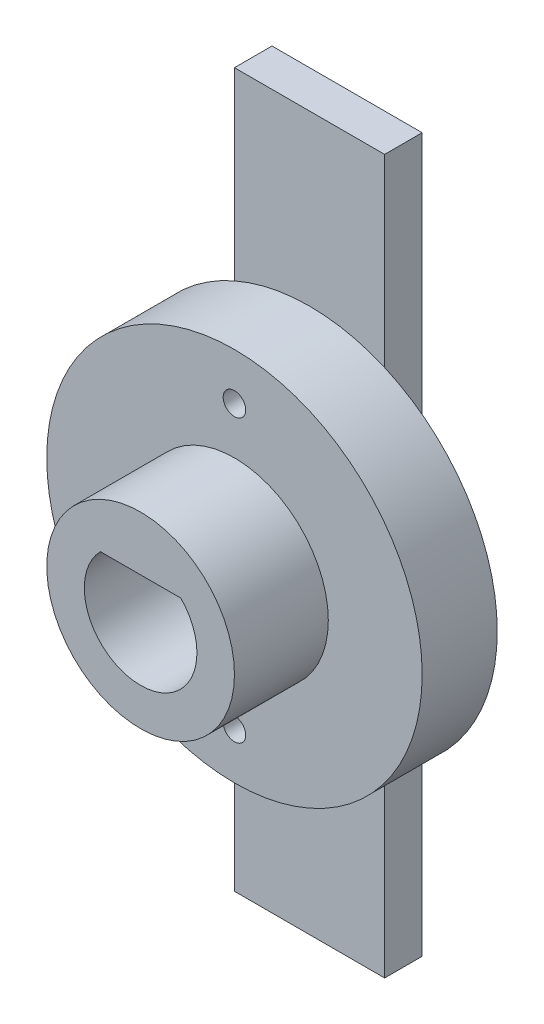
ISO-10303-21;
HEADER;
FILE_DESCRIPTION(('STEP AP214'),'2;1');
FILE_NAME('part.step','',(''),(''),'','','');
FILE_SCHEMA(('AUTOMOTIVE_DESIGN { 1 0 10303 214 1 1 1 1 }'));
ENDSEC;
DATA;
#1=APPLICATION_CONTEXT('core data for automotive mechanical design processes');
#2=APPLICATION_PROTOCOL_DEFINITION('international standard','automotive_design',2000,#1);
#3=PRODUCT_CONTEXT('',#1,'mechanical');
#4=PRODUCT('Part','Part','',(#3));
#5=PRODUCT_RELATED_PRODUCT_CATEGORY('part','',(#4));
#6=PRODUCT_DEFINITION_FORMATION('','',#4);
#7=PRODUCT_DEFINITION_CONTEXT('part definition',#1,'design');
#8=PRODUCT_DEFINITION('design','',#6,#7);
#9=PRODUCT_DEFINITION_SHAPE('','',#8);
#10=(LENGTH_UNIT() NAMED_UNIT(*) SI_UNIT(.MILLI.,.METRE.));
#11=(NAMED_UNIT(*) PLANE_ANGLE_UNIT() SI_UNIT($,.RADIAN.));
#12=(NAMED_UNIT(*) SI_UNIT($,.STERADIAN.) SOLID_ANGLE_UNIT());
#13=UNCERTAINTY_MEASURE_WITH_UNIT(LENGTH_MEASURE(1.E-05),#10,'distance_accuracy_value','');
#14=(GEOMETRIC_REPRESENTATION_CONTEXT(3) GLOBAL_UNCERTAINTY_ASSIGNED_CONTEXT((#13)) GLOBAL_UNIT_ASSIGNED_CONTEXT((#10,
#11,#12)) REPRESENTATION_CONTEXT('',''));
#15=CARTESIAN_POINT('',(0.,0.,0.));
#16=DIRECTION('',(0.,0.,1.));
#17=DIRECTION('',(1.,0.,0.));
#18=AXIS2_PLACEMENT_3D('',#15,#16,#17);
#19=CARTESIAN_POINT('',(0.,0.,0.));
#20=DIRECTION('',(0.,0.,1.));
#21=DIRECTION('',(1.,0.,0.));
#22=AXIS2_PLACEMENT_3D('',#19,#20,#21);
#23=PLANE('',#22);
#24=DIRECTION('',(0.,-1.,0.));
#25=VECTOR('',#24,1.);
#26=CARTESIAN_POINT('',(4.,19.,0.));
#27=LINE('',#26,#25);
#28=CARTESIAN_POINT('',(4.,9.16515138991168,0.));
#29=VERTEX_POINT('',#28);
#30=CARTESIAN_POINT('',(4.,-9.16515138991168,0.));
#31=VERTEX_POINT('',#30);
#32=EDGE_CURVE('E11',#29,#31,#27,.T.);
#33=ORIENTED_EDGE('',*,*,#32,.F.);
#34=CARTESIAN_POINT('',(0.,0.,0.));
#35=DIRECTION('',(0.,0.,1.));
#36=DIRECTION('',(1.,0.,0.));
#37=AXIS2_PLACEMENT_3D('',#34,#35,#36);
#38=CIRCLE('',#37,10.);
#39=EDGE_CURVE('E58',#31,#29,#38,.T.);
#40=ORIENTED_EDGE('',*,*,#39,.F.);
#41=EDGE_LOOP('',(#33,#40));
#42=FACE_BOUND('',#41,.T.);
#43=ADVANCED_FACE('F39',(#42),#23,.F.);
#44=DIRECTION('',(0.,1.,0.));
#45=VECTOR('',#44,1.);
#46=CARTESIAN_POINT('',(-4.,19.,0.));
#47=LINE('',#46,#45);
#48=CARTESIAN_POINT('',(-4.,-9.16515138991168,0.));
#49=VERTEX_POINT('',#48);
#50=CARTESIAN_POINT('',(-4.,9.16515138991168,0.));
#51=VERTEX_POINT('',#50);
#52=EDGE_CURVE('E49',#49,#51,#47,.T.);
#53=ORIENTED_EDGE('',*,*,#52,.F.);
#54=EDGE_CURVE('E197',#51,#49,#38,.T.);
#55=ORIENTED_EDGE('',*,*,#54,.F.);
#56=EDGE_LOOP('',(#53,#55));
#57=FACE_BOUND('',#56,.T.);
#58=ADVANCED_FACE('F213',(#57),#23,.F.);
#59=CARTESIAN_POINT('',(0.,0.,4.));
#60=DIRECTION('',(0.,0.,1.));
#61=DIRECTION('',(1.,0.,0.));
#62=AXIS2_PLACEMENT_3D('',#59,#60,#61);
#63=PLANE('',#62);
#64=CARTESIAN_POINT('',(0.,7.5,4.));
#65=DIRECTION('',(0.,0.,1.));
#66=DIRECTION('',(1.,0.,0.));
#67=AXIS2_PLACEMENT_3D('',#64,#65,#66);
#68=CIRCLE('',#67,0.6);
#69=CARTESIAN_POINT('',(0.599999999999998,7.5,4.));
#70=VERTEX_POINT('',#69);
#71=EDGE_CURVE('E173',#70,#70,#68,.T.);
#72=ORIENTED_EDGE('',*,*,#71,.F.);
#73=EDGE_LOOP('',(#72));
#74=FACE_BOUND('',#73,.T.);
#75=CARTESIAN_POINT('',(0.,0.,4.));
#76=DIRECTION('',(0.,0.,1.));
#77=DIRECTION('',(1.,0.,0.));
#78=AXIS2_PLACEMENT_3D('',#75,#76,#77);
#79=CIRCLE('',#78,10.);
#80=CARTESIAN_POINT('',(10.,0.,4.));
#81=VERTEX_POINT('',#80);
#82=EDGE_CURVE('E187',#81,#81,#79,.T.);
#83=ORIENTED_EDGE('',*,*,#82,.T.);
#84=EDGE_LOOP('',(#83));
#85=FACE_BOUND('',#84,.T.);
#86=CARTESIAN_POINT('',(0.,-7.5,4.));
#87=DIRECTION('',(0.,0.,1.));
#88=DIRECTION('',(1.,0.,0.));
#89=AXIS2_PLACEMENT_3D('',#86,#87,#88);
#90=CIRCLE('',#89,0.6);
#91=CARTESIAN_POINT('',(0.6,-7.5,4.));
#92=VERTEX_POINT('',#91);
#93=EDGE_CURVE('E181',#92,#92,#90,.T.);
#94=ORIENTED_EDGE('',*,*,#93,.F.);
#95=EDGE_LOOP('',(#94));
#96=FACE_BOUND('',#95,.T.);
#97=CARTESIAN_POINT('',(0.,0.,4.));
#98=DIRECTION('',(0.,0.,1.));
#99=DIRECTION('',(1.,0.,0.));
#100=AXIS2_PLACEMENT_3D('',#97,#98,#99);
#101=CIRCLE('',#100,5.);
#102=CARTESIAN_POINT('',(5.,0.,4.));
#103=VERTEX_POINT('',#102);
#104=EDGE_CURVE('E164',#103,#103,#101,.T.);
#105=ORIENTED_EDGE('',*,*,#104,.F.);
#106=EDGE_LOOP('',(#105));
#107=FACE_BOUND('',#106,.T.);
#108=ADVANCED_FACE('F217',(#74,#85,#96,#107),#63,.T.);
#109=CARTESIAN_POINT('',(0.,0.,4.));
#110=DIRECTION('',(0.,0.,-1.));
#111=DIRECTION('',(-1.,0.,0.));
#112=AXIS2_PLACEMENT_3D('',#109,#110,#111);
#113=CYLINDRICAL_SURFACE('',#112,10.);
#114=ORIENTED_EDGE('',*,*,#82,.F.);
#115=EDGE_LOOP('',(#114));
#116=FACE_BOUND('',#115,.T.);
#117=EDGE_CURVE('E43',#29,#51,#38,.T.);
#118=ORIENTED_EDGE('',*,*,#117,.T.);
#119=ORIENTED_EDGE('',*,*,#54,.T.);
#120=EDGE_CURVE('E201',#49,#31,#38,.T.);
#121=ORIENTED_EDGE('',*,*,#120,.T.);
#122=ORIENTED_EDGE('',*,*,#39,.T.);
#123=EDGE_LOOP('',(#118,#119,#121,#122));
#124=FACE_BOUND('',#123,.T.);
#125=ADVANCED_FACE('F41',(#116,#124),#113,.T.);
#126=CARTESIAN_POINT('',(0.,-7.5,4.));
#127=DIRECTION('',(0.,0.,-1.));
#128=DIRECTION('',(-1.,0.,0.));
#129=AXIS2_PLACEMENT_3D('',#126,#127,#128);
#130=CYLINDRICAL_SURFACE('',#129,0.6);
#131=ORIENTED_EDGE('',*,*,#93,.T.);
#132=EDGE_LOOP('',(#131));
#133=FACE_BOUND('',#132,.T.);
#134=CARTESIAN_POINT('',(0.,-7.5,0.));
#135=DIRECTION('',(0.,0.,1.));
#136=DIRECTION('',(1.,0.,0.));
#137=AXIS2_PLACEMENT_3D('',#134,#135,#136);
#138=CIRCLE('',#137,0.6);
#139=CARTESIAN_POINT('',(0.6,-7.5,0.));
#140=VERTEX_POINT('',#139);
#141=EDGE_CURVE('E177',#140,#140,#138,.T.);
#142=ORIENTED_EDGE('',*,*,#141,.F.);
#143=EDGE_LOOP('',(#142));
#144=FACE_BOUND('',#143,.T.);
#145=ADVANCED_FACE('F224',(#133,#144),#130,.F.);
#146=CARTESIAN_POINT('',(0.,7.5,4.));
#147=DIRECTION('',(0.,0.,-1.));
#148=DIRECTION('',(-1.,0.,0.));
#149=AXIS2_PLACEMENT_3D('',#146,#147,#148);
#150=CYLINDRICAL_SURFACE('',#149,0.6);
#151=ORIENTED_EDGE('',*,*,#71,.T.);
#152=EDGE_LOOP('',(#151));
#153=FACE_BOUND('',#152,.T.);
#154=CARTESIAN_POINT('',(0.,7.5,0.));
#155=DIRECTION('',(0.,0.,1.));
#156=DIRECTION('',(1.,0.,0.));
#157=AXIS2_PLACEMENT_3D('',#154,#155,#156);
#158=CIRCLE('',#157,0.6);
#159=CARTESIAN_POINT('',(0.599999999999998,7.5,0.));
#160=VERTEX_POINT('',#159);
#161=EDGE_CURVE('E169',#160,#160,#158,.T.);
#162=ORIENTED_EDGE('',*,*,#161,.F.);
#163=EDGE_LOOP('',(#162));
#164=FACE_BOUND('',#163,.T.);
#165=ADVANCED_FACE('F227',(#153,#164),#150,.F.);
#166=CARTESIAN_POINT('',(0.,0.,9.));
#167=DIRECTION('',(0.,0.,1.));
#168=DIRECTION('',(1.,0.,0.));
#169=AXIS2_PLACEMENT_3D('',#166,#167,#168);
#170=PLANE('',#169);
#171=CARTESIAN_POINT('',(0.,0.,9.));
#172=DIRECTION('',(0.,0.,1.));
#173=DIRECTION('',(1.,0.,0.));
#174=AXIS2_PLACEMENT_3D('',#171,#172,#173);
#175=CIRCLE('',#174,5.);
#176=CARTESIAN_POINT('',(5.,0.,9.));
#177=VERTEX_POINT('',#176);
#178=EDGE_CURVE('E165',#177,#177,#175,.T.);
#179=ORIENTED_EDGE('',*,*,#178,.T.);
#180=EDGE_LOOP('',(#179));
#181=FACE_BOUND('',#180,.T.);
#182=DIRECTION('',(-1.,0.,0.));
#183=VECTOR('',#182,1.);
#184=CARTESIAN_POINT('',(-2.14242852856286,2.1,9.));
#185=LINE('',#184,#183);
#186=CARTESIAN_POINT('',(2.14242852856286,2.1,9.));
#187=VERTEX_POINT('',#186);
#188=CARTESIAN_POINT('',(-2.14242852856286,2.1,9.));
#189=VERTEX_POINT('',#188);
#190=EDGE_CURVE('E151',#187,#189,#185,.T.);
#191=ORIENTED_EDGE('',*,*,#190,.F.);
#192=CARTESIAN_POINT('',(0.,0.,9.));
#193=DIRECTION('',(0.,0.,1.));
#194=DIRECTION('',(1.,0.,0.));
#195=AXIS2_PLACEMENT_3D('',#192,#193,#194);
#196=CIRCLE('',#195,3.);
#197=EDGE_CURVE('E147',#189,#187,#196,.T.);
#198=ORIENTED_EDGE('',*,*,#197,.F.);
#199=EDGE_LOOP('',(#191,#198));
#200=FACE_BOUND('',#199,.T.);
#201=ADVANCED_FACE('F231',(#181,#200),#170,.T.);
#202=CARTESIAN_POINT('',(0.,0.,9.));
#203=DIRECTION('',(0.,0.,-1.));
#204=DIRECTION('',(-1.,0.,0.));
#205=AXIS2_PLACEMENT_3D('',#202,#203,#204);
#206=CYLINDRICAL_SURFACE('',#205,5.);
#207=ORIENTED_EDGE('',*,*,#178,.F.);
#208=EDGE_LOOP('',(#207));
#209=FACE_BOUND('',#208,.T.);
#210=ORIENTED_EDGE('',*,*,#104,.T.);
#211=EDGE_LOOP('',(#210));
#212=FACE_BOUND('',#211,.T.);
#213=ADVANCED_FACE('F233',(#209,#212),#206,.T.);
#214=CARTESIAN_POINT('',(0.,0.,9.));
#215=DIRECTION('',(0.,0.,-1.));
#216=DIRECTION('',(-1.,0.,0.));
#217=AXIS2_PLACEMENT_3D('',#214,#215,#216);
#218=CYLINDRICAL_SURFACE('',#217,3.);
#219=CARTESIAN_POINT('',(0.,0.,4.));
#220=DIRECTION('',(0.,0.,1.));
#221=DIRECTION('',(1.,0.,0.));
#222=AXIS2_PLACEMENT_3D('',#219,#220,#221);
#223=CIRCLE('',#222,3.);
#224=CARTESIAN_POINT('',(-2.14242852856286,2.1,4.));
#225=VERTEX_POINT('',#224);
#226=CARTESIAN_POINT('',(2.14242852856286,2.1,4.));
#227=VERTEX_POINT('',#226);
#228=EDGE_CURVE('E137',#225,#227,#223,.T.);
#229=ORIENTED_EDGE('',*,*,#228,.F.);
#230=DIRECTION('',(0.,0.,-1.));
#231=VECTOR('',#230,1.);
#232=CARTESIAN_POINT('',(-2.14242852856286,2.1,9.));
#233=LINE('',#232,#231);
#234=EDGE_CURVE('E153',#189,#225,#233,.T.);
#235=ORIENTED_EDGE('',*,*,#234,.F.);
#236=ORIENTED_EDGE('',*,*,#197,.T.);
#237=DIRECTION('',(0.,0.,-1.));
#238=VECTOR('',#237,1.);
#239=CARTESIAN_POINT('',(2.14242852856286,2.1,9.));
#240=LINE('',#239,#238);
#241=EDGE_CURVE('E160',#187,#227,#240,.T.);
#242=ORIENTED_EDGE('',*,*,#241,.T.);
#243=EDGE_LOOP('',(#229,#235,#236,#242));
#244=FACE_BOUND('',#243,.T.);
#245=ADVANCED_FACE('F236',(#244),#218,.F.);
#246=CARTESIAN_POINT('',(-2.14242852856286,2.1,9.));
#247=DIRECTION('',(0.,-1.,0.));
#248=DIRECTION('',(0.,0.,-1.));
#249=AXIS2_PLACEMENT_3D('',#246,#247,#248);
#250=PLANE('',#249);
#251=DIRECTION('',(-1.,0.,0.));
#252=VECTOR('',#251,1.);
#253=CARTESIAN_POINT('',(-2.14242852856286,2.1,4.));
#254=LINE('',#253,#252);
#255=EDGE_CURVE('E141',#227,#225,#254,.T.);
#256=ORIENTED_EDGE('',*,*,#255,.F.);
#257=ORIENTED_EDGE('',*,*,#241,.F.);
#258=ORIENTED_EDGE('',*,*,#190,.T.);
#259=ORIENTED_EDGE('',*,*,#234,.T.);
#260=EDGE_LOOP('',(#256,#257,#258,#259));
#261=FACE_BOUND('',#260,.T.);
#262=ADVANCED_FACE('F222',(#261),#250,.T.);
#263=ORIENTED_EDGE('',*,*,#228,.T.);
#264=ORIENTED_EDGE('',*,*,#255,.T.);
#265=EDGE_LOOP('',(#263,#264));
#266=FACE_BOUND('',#265,.T.);
#267=ADVANCED_FACE('F219',(#266),#63,.T.);
#268=CARTESIAN_POINT('',(0.,0.,0.));
#269=DIRECTION('',(0.,0.,-1.));
#270=DIRECTION('',(-1.,0.,0.));
#271=AXIS2_PLACEMENT_3D('',#268,#269,#270);
#272=PLANE('',#271);
#273=ORIENTED_EDGE('',*,*,#120,.F.);
#274=CARTESIAN_POINT('',(-4.,-19.,0.));
#275=VERTEX_POINT('',#274);
#276=EDGE_CURVE('E195',#275,#49,#47,.T.);
#277=ORIENTED_EDGE('',*,*,#276,.F.);
#278=DIRECTION('',(-1.,0.,0.));
#279=VECTOR('',#278,1.);
#280=CARTESIAN_POINT('',(4.,-19.,0.));
#281=LINE('',#280,#279);
#282=CARTESIAN_POINT('',(4.,-19.,0.));
#283=VERTEX_POINT('',#282);
#284=EDGE_CURVE('E209',#283,#275,#281,.T.);
#285=ORIENTED_EDGE('',*,*,#284,.F.);
#286=EDGE_CURVE('E52',#31,#283,#27,.T.);
#287=ORIENTED_EDGE('',*,*,#286,.F.);
#288=EDGE_LOOP('',(#273,#277,#285,#287));
#289=FACE_BOUND('',#288,.T.);
#290=ADVANCED_FACE('F208',(#289),#272,.F.);
#291=CARTESIAN_POINT('',(0.,0.,-2.));
#292=DIRECTION('',(0.,0.,-1.));
#293=DIRECTION('',(-1.,0.,0.));
#294=AXIS2_PLACEMENT_3D('',#291,#292,#293);
#295=PLANE('',#294);
#296=DIRECTION('',(0.,-1.,0.));
#297=VECTOR('',#296,1.);
#298=CARTESIAN_POINT('',(4.,19.,-2.));
#299=LINE('',#298,#297);
#300=CARTESIAN_POINT('',(4.,19.,-2.));
#301=VERTEX_POINT('',#300);
#302=CARTESIAN_POINT('',(4.,-19.,-2.));
#303=VERTEX_POINT('',#302);
#304=EDGE_CURVE('E120',#301,#303,#299,.T.);
#305=ORIENTED_EDGE('',*,*,#304,.T.);
#306=DIRECTION('',(-1.,0.,0.));
#307=VECTOR('',#306,1.);
#308=CARTESIAN_POINT('',(4.,-19.,-2.));
#309=LINE('',#308,#307);
#310=CARTESIAN_POINT('',(-4.,-19.,-2.));
#311=VERTEX_POINT('',#310);
#312=EDGE_CURVE('E109',#303,#311,#309,.T.);
#313=ORIENTED_EDGE('',*,*,#312,.T.);
#314=DIRECTION('',(0.,1.,0.));
#315=VECTOR('',#314,1.);
#316=CARTESIAN_POINT('',(-4.,19.,-2.));
#317=LINE('',#316,#315);
#318=CARTESIAN_POINT('',(-4.,19.,-2.));
#319=VERTEX_POINT('',#318);
#320=EDGE_CURVE('E119',#311,#319,#317,.T.);
#321=ORIENTED_EDGE('',*,*,#320,.T.);
#322=DIRECTION('',(1.,0.,0.));
#323=VECTOR('',#322,1.);
#324=CARTESIAN_POINT('',(4.,19.,-2.));
#325=LINE('',#324,#323);
#326=EDGE_CURVE('E125',#319,#301,#325,.T.);
#327=ORIENTED_EDGE('',*,*,#326,.T.);
#328=EDGE_LOOP('',(#305,#313,#321,#327));
#329=FACE_BOUND('',#328,.T.);
#330=ADVANCED_FACE('F123',(#329),#295,.T.);
#331=CARTESIAN_POINT('',(4.,19.,-2.));
#332=DIRECTION('',(0.,-1.,0.));
#333=DIRECTION('',(0.,0.,-1.));
#334=AXIS2_PLACEMENT_3D('',#331,#332,#333);
#335=PLANE('',#334);
#336=DIRECTION('',(1.,0.,0.));
#337=VECTOR('',#336,1.);
#338=CARTESIAN_POINT('',(4.,19.,0.));
#339=LINE('',#338,#337);
#340=CARTESIAN_POINT('',(-4.,19.,0.));
#341=VERTEX_POINT('',#340);
#342=CARTESIAN_POINT('',(4.,19.,0.));
#343=VERTEX_POINT('',#342);
#344=EDGE_CURVE('E130',#341,#343,#339,.T.);
#345=ORIENTED_EDGE('',*,*,#344,.T.);
#346=DIRECTION('',(0.,0.,1.));
#347=VECTOR('',#346,1.);
#348=CARTESIAN_POINT('',(4.,19.,-2.));
#349=LINE('',#348,#347);
#350=EDGE_CURVE('E413',#301,#343,#349,.T.);
#351=ORIENTED_EDGE('',*,*,#350,.F.);
#352=ORIENTED_EDGE('',*,*,#326,.F.);
#353=DIRECTION('',(0.,0.,1.));
#354=VECTOR('',#353,1.);
#355=CARTESIAN_POINT('',(-4.,19.,-2.));
#356=LINE('',#355,#354);
#357=EDGE_CURVE('E143',#319,#341,#356,.T.);
#358=ORIENTED_EDGE('',*,*,#357,.T.);
#359=EDGE_LOOP('',(#345,#351,#352,#358));
#360=FACE_BOUND('',#359,.T.);
#361=ADVANCED_FACE('F255',(#360),#335,.F.);
#362=CARTESIAN_POINT('',(-4.,19.,-2.));
#363=DIRECTION('',(1.,0.,0.));
#364=DIRECTION('',(0.,0.,-1.));
#365=AXIS2_PLACEMENT_3D('',#362,#363,#364);
#366=PLANE('',#365);
#367=ORIENTED_EDGE('',*,*,#276,.T.);
#368=ORIENTED_EDGE('',*,*,#52,.T.);
#369=EDGE_CURVE('E196',#51,#341,#47,.T.);
#370=ORIENTED_EDGE('',*,*,#369,.T.);
#371=ORIENTED_EDGE('',*,*,#357,.F.);
#372=ORIENTED_EDGE('',*,*,#320,.F.);
#373=DIRECTION('',(0.,0.,1.));
#374=VECTOR('',#373,1.);
#375=CARTESIAN_POINT('',(-4.,-19.,-2.));
#376=LINE('',#375,#374);
#377=EDGE_CURVE('E115',#311,#275,#376,.T.);
#378=ORIENTED_EDGE('',*,*,#377,.T.);
#379=EDGE_LOOP('',(#367,#368,#370,#371,#372,#378));
#380=FACE_BOUND('',#379,.T.);
#381=ADVANCED_FACE('F252',(#380),#366,.F.);
#382=CARTESIAN_POINT('',(4.,-19.,-2.));
#383=DIRECTION('',(0.,1.,0.));
#384=DIRECTION('',(0.,0.,1.));
#385=AXIS2_PLACEMENT_3D('',#382,#383,#384);
#386=PLANE('',#385);
#387=ORIENTED_EDGE('',*,*,#284,.T.);
#388=ORIENTED_EDGE('',*,*,#377,.F.);
#389=ORIENTED_EDGE('',*,*,#312,.F.);
#390=DIRECTION('',(0.,0.,1.));
#391=VECTOR('',#390,1.);
#392=CARTESIAN_POINT('',(4.,-19.,-2.));
#393=LINE('',#392,#391);
#394=EDGE_CURVE('E113',#303,#283,#393,.T.);
#395=ORIENTED_EDGE('',*,*,#394,.T.);
#396=EDGE_LOOP('',(#387,#388,#389,#395));
#397=FACE_BOUND('',#396,.T.);
#398=ADVANCED_FACE('F111',(#397),#386,.F.);
#399=CARTESIAN_POINT('',(4.,19.,-2.));
#400=DIRECTION('',(-1.,0.,0.));
#401=DIRECTION('',(0.,-1.,0.));
#402=AXIS2_PLACEMENT_3D('',#399,#400,#401);
#403=PLANE('',#402);
#404=EDGE_CURVE('E51',#343,#29,#27,.T.);
#405=ORIENTED_EDGE('',*,*,#404,.T.);
#406=ORIENTED_EDGE('',*,*,#32,.T.);
#407=ORIENTED_EDGE('',*,*,#286,.T.);
#408=ORIENTED_EDGE('',*,*,#394,.F.);
#409=ORIENTED_EDGE('',*,*,#304,.F.);
#410=ORIENTED_EDGE('',*,*,#350,.T.);
#411=EDGE_LOOP('',(#405,#406,#407,#408,#409,#410));
#412=FACE_BOUND('',#411,.T.);
#413=ADVANCED_FACE('F133',(#412),#403,.F.);
#414=ORIENTED_EDGE('',*,*,#117,.F.);
#415=ORIENTED_EDGE('',*,*,#404,.F.);
#416=ORIENTED_EDGE('',*,*,#344,.F.);
#417=ORIENTED_EDGE('',*,*,#369,.F.);
#418=EDGE_LOOP('',(#414,#415,#416,#417));
#419=FACE_BOUND('',#418,.T.);
#420=ADVANCED_FACE('F249',(#419),#272,.F.);
#421=ORIENTED_EDGE('',*,*,#161,.T.);
#422=EDGE_LOOP('',(#421));
#423=FACE_BOUND('',#422,.T.);
#424=ADVANCED_FACE('F262',(#423),#272,.F.);
#425=ORIENTED_EDGE('',*,*,#141,.T.);
#426=EDGE_LOOP('',(#425));
#427=FACE_BOUND('',#426,.T.);
#428=ADVANCED_FACE('F291',(#427),#272,.F.);
#429=CLOSED_SHELL('',(#43,#58,#108,#125,#145,#165,#201,#213,#245,#262,#267,#290,#330,#361,#381,
#398,#413,#420,#424,#428));
#430=MANIFOLD_SOLID_BREP('B2',#429);
#431=ADVANCED_BREP_SHAPE_REPRESENTATION('',(#18,#430),#14);
#432=SHAPE_DEFINITION_REPRESENTATION(#9,#431);
ENDSEC;
END-ISO-10303-21;
